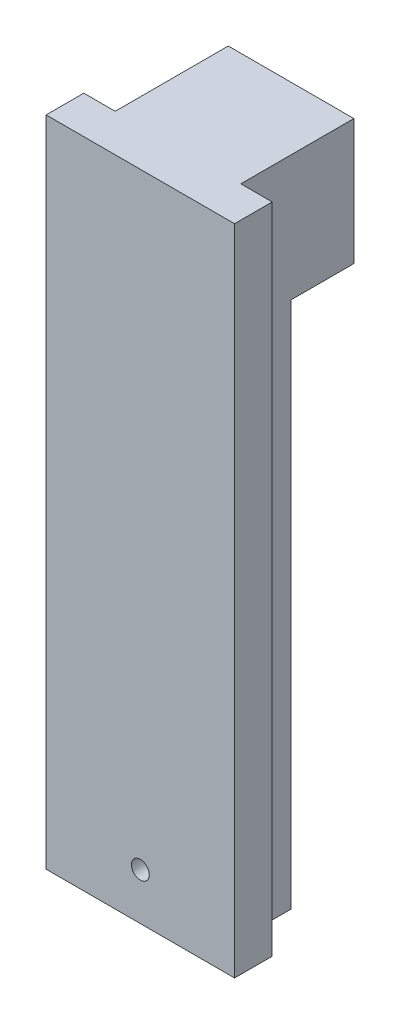
ISO-10303-21;
HEADER;
FILE_DESCRIPTION(('STEP AP214'),'2;1');
FILE_NAME('part.step','',(''),(''),'','','');
FILE_SCHEMA(('AUTOMOTIVE_DESIGN { 1 0 10303 214 1 1 1 1 }'));
ENDSEC;
DATA;
#1=APPLICATION_CONTEXT('core data for automotive mechanical design processes');
#2=APPLICATION_PROTOCOL_DEFINITION('international standard','automotive_design',2000,#1);
#3=PRODUCT_CONTEXT('',#1,'mechanical');
#4=PRODUCT('Part','Part','',(#3));
#5=PRODUCT_RELATED_PRODUCT_CATEGORY('part','',(#4));
#6=PRODUCT_DEFINITION_FORMATION('','',#4);
#7=PRODUCT_DEFINITION_CONTEXT('part definition',#1,'design');
#8=PRODUCT_DEFINITION('design','',#6,#7);
#9=PRODUCT_DEFINITION_SHAPE('','',#8);
#10=(LENGTH_UNIT() NAMED_UNIT(*) SI_UNIT(.MILLI.,.METRE.));
#11=(NAMED_UNIT(*) PLANE_ANGLE_UNIT() SI_UNIT($,.RADIAN.));
#12=(NAMED_UNIT(*) SI_UNIT($,.STERADIAN.) SOLID_ANGLE_UNIT());
#13=UNCERTAINTY_MEASURE_WITH_UNIT(LENGTH_MEASURE(1.E-05),#10,'distance_accuracy_value','');
#14=(GEOMETRIC_REPRESENTATION_CONTEXT(3) GLOBAL_UNCERTAINTY_ASSIGNED_CONTEXT((#13)) GLOBAL_UNIT_ASSIGNED_CONTEXT((#10,
#11,#12)) REPRESENTATION_CONTEXT('',''));
#15=CARTESIAN_POINT('',(0.,0.,0.));
#16=DIRECTION('',(0.,0.,1.));
#17=DIRECTION('',(1.,0.,0.));
#18=AXIS2_PLACEMENT_3D('',#15,#16,#17);
#19=CARTESIAN_POINT('',(10.,104.,-14.));
#20=DIRECTION('',(0.,0.,1.));
#21=DIRECTION('',(1.,0.,0.));
#22=AXIS2_PLACEMENT_3D('',#19,#20,#21);
#23=PLANE('',#22);
#24=CARTESIAN_POINT('',(0.,7.425,-14.));
#25=DIRECTION('',(0.,0.,1.));
#26=DIRECTION('',(1.,0.,0.));
#27=AXIS2_PLACEMENT_3D('',#24,#25,#26);
#28=CIRCLE('',#27,1.425);
#29=CARTESIAN_POINT('',(1.425,7.425,-14.));
#30=VERTEX_POINT('',#29);
#31=EDGE_CURVE('E344',#30,#30,#28,.T.);
#32=ORIENTED_EDGE('',*,*,#31,.T.);
#33=EDGE_LOOP('',(#32));
#34=FACE_BOUND('',#33,.T.);
#35=DIRECTION('',(-1.,0.,0.));
#36=VECTOR('',#35,1.);
#37=CARTESIAN_POINT('',(-10.,84.,-14.));
#38=LINE('',#37,#36);
#39=CARTESIAN_POINT('',(10.,84.,-14.));
#40=VERTEX_POINT('',#39);
#41=CARTESIAN_POINT('',(-10.,84.,-14.));
#42=VERTEX_POINT('',#41);
#43=EDGE_CURVE('E60',#40,#42,#38,.T.);
#44=ORIENTED_EDGE('',*,*,#43,.F.);
#45=DIRECTION('',(0.,-1.,0.));
#46=VECTOR('',#45,1.);
#47=CARTESIAN_POINT('',(10.,104.,-14.));
#48=LINE('',#47,#46);
#49=CARTESIAN_POINT('',(10.,0.,-14.));
#50=VERTEX_POINT('',#49);
#51=EDGE_CURVE('E144',#40,#50,#48,.T.);
#52=ORIENTED_EDGE('',*,*,#51,.T.);
#53=DIRECTION('',(-1.,0.,0.));
#54=VECTOR('',#53,1.);
#55=CARTESIAN_POINT('',(10.,0.,-14.));
#56=LINE('',#55,#54);
#57=CARTESIAN_POINT('',(-10.,0.,-14.));
#58=VERTEX_POINT('',#57);
#59=EDGE_CURVE('E177',#50,#58,#56,.T.);
#60=ORIENTED_EDGE('',*,*,#59,.T.);
#61=DIRECTION('',(0.,-1.,0.));
#62=VECTOR('',#61,1.);
#63=CARTESIAN_POINT('',(-10.,104.,-14.));
#64=LINE('',#63,#62);
#65=EDGE_CURVE('E192',#42,#58,#64,.T.);
#66=ORIENTED_EDGE('',*,*,#65,.F.);
#67=EDGE_LOOP('',(#44,#52,#60,#66));
#68=FACE_BOUND('',#67,.T.);
#69=ADVANCED_FACE('F44',(#34,#68),#23,.F.);
#70=CARTESIAN_POINT('',(-15.,104.,-6.));
#71=DIRECTION('',(1.,0.,0.));
#72=DIRECTION('',(0.,0.,-1.));
#73=AXIS2_PLACEMENT_3D('',#70,#71,#72);
#74=PLANE('',#73);
#75=DIRECTION('',(0.,0.,1.));
#76=VECTOR('',#75,1.);
#77=CARTESIAN_POINT('',(-15.,0.,-6.));
#78=LINE('',#77,#76);
#79=CARTESIAN_POINT('',(-15.,0.,-6.));
#80=VERTEX_POINT('',#79);
#81=CARTESIAN_POINT('',(-15.,0.,0.));
#82=VERTEX_POINT('',#81);
#83=EDGE_CURVE('E161',#80,#82,#78,.T.);
#84=ORIENTED_EDGE('',*,*,#83,.T.);
#85=DIRECTION('',(0.,-1.,0.));
#86=VECTOR('',#85,1.);
#87=CARTESIAN_POINT('',(-15.,104.,0.));
#88=LINE('',#87,#86);
#89=CARTESIAN_POINT('',(-15.,104.,0.));
#90=VERTEX_POINT('',#89);
#91=EDGE_CURVE('E11',#90,#82,#88,.T.);
#92=ORIENTED_EDGE('',*,*,#91,.F.);
#93=DIRECTION('',(0.,0.,1.));
#94=VECTOR('',#93,1.);
#95=CARTESIAN_POINT('',(-15.,104.,-6.));
#96=LINE('',#95,#94);
#97=CARTESIAN_POINT('',(-15.,104.,-6.));
#98=VERTEX_POINT('',#97);
#99=EDGE_CURVE('E186',#98,#90,#96,.T.);
#100=ORIENTED_EDGE('',*,*,#99,.F.);
#101=DIRECTION('',(0.,-1.,0.));
#102=VECTOR('',#101,1.);
#103=CARTESIAN_POINT('',(-15.,104.,-6.));
#104=LINE('',#103,#102);
#105=EDGE_CURVE('E160',#98,#80,#104,.T.);
#106=ORIENTED_EDGE('',*,*,#105,.T.);
#107=EDGE_LOOP('',(#84,#92,#100,#106));
#108=FACE_BOUND('',#107,.T.);
#109=ADVANCED_FACE('F46',(#108),#74,.F.);
#110=CARTESIAN_POINT('',(-15.,104.,0.));
#111=DIRECTION('',(0.,0.,-1.));
#112=DIRECTION('',(-1.,0.,0.));
#113=AXIS2_PLACEMENT_3D('',#110,#111,#112);
#114=PLANE('',#113);
#115=CARTESIAN_POINT('',(0.,7.425,0.));
#116=DIRECTION('',(0.,0.,1.));
#117=DIRECTION('',(1.,0.,0.));
#118=AXIS2_PLACEMENT_3D('',#115,#116,#117);
#119=CIRCLE('',#118,1.425);
#120=CARTESIAN_POINT('',(1.425,7.425,0.));
#121=VERTEX_POINT('',#120);
#122=EDGE_CURVE('E342',#121,#121,#119,.T.);
#123=ORIENTED_EDGE('',*,*,#122,.F.);
#124=EDGE_LOOP('',(#123));
#125=FACE_BOUND('',#124,.T.);
#126=DIRECTION('',(1.,0.,0.));
#127=VECTOR('',#126,1.);
#128=CARTESIAN_POINT('',(-15.,0.,0.));
#129=LINE('',#128,#127);
#130=CARTESIAN_POINT('',(15.,0.,0.));
#131=VERTEX_POINT('',#130);
#132=EDGE_CURVE('E165',#82,#131,#129,.T.);
#133=ORIENTED_EDGE('',*,*,#132,.T.);
#134=DIRECTION('',(0.,-1.,0.));
#135=VECTOR('',#134,1.);
#136=CARTESIAN_POINT('',(15.,104.,0.));
#137=LINE('',#136,#135);
#138=CARTESIAN_POINT('',(15.,104.,0.));
#139=VERTEX_POINT('',#138);
#140=EDGE_CURVE('E53',#139,#131,#137,.T.);
#141=ORIENTED_EDGE('',*,*,#140,.F.);
#142=DIRECTION('',(1.,0.,0.));
#143=VECTOR('',#142,1.);
#144=CARTESIAN_POINT('',(-15.,104.,0.));
#145=LINE('',#144,#143);
#146=EDGE_CURVE('E109',#90,#139,#145,.T.);
#147=ORIENTED_EDGE('',*,*,#146,.F.);
#148=ORIENTED_EDGE('',*,*,#91,.T.);
#149=EDGE_LOOP('',(#133,#141,#147,#148));
#150=FACE_BOUND('',#149,.T.);
#151=ADVANCED_FACE('F232',(#125,#150),#114,.F.);
#152=CARTESIAN_POINT('',(15.,104.,0.));
#153=DIRECTION('',(-1.,0.,0.));
#154=DIRECTION('',(0.,0.,1.));
#155=AXIS2_PLACEMENT_3D('',#152,#153,#154);
#156=PLANE('',#155);
#157=DIRECTION('',(0.,0.,-1.));
#158=VECTOR('',#157,1.);
#159=CARTESIAN_POINT('',(15.,0.,0.));
#160=LINE('',#159,#158);
#161=CARTESIAN_POINT('',(15.,0.,-6.));
#162=VERTEX_POINT('',#161);
#163=EDGE_CURVE('E169',#131,#162,#160,.T.);
#164=ORIENTED_EDGE('',*,*,#163,.T.);
#165=DIRECTION('',(0.,-1.,0.));
#166=VECTOR('',#165,1.);
#167=CARTESIAN_POINT('',(15.,104.,-6.));
#168=LINE('',#167,#166);
#169=CARTESIAN_POINT('',(15.,104.,-6.));
#170=VERTEX_POINT('',#169);
#171=EDGE_CURVE('E143',#170,#162,#168,.T.);
#172=ORIENTED_EDGE('',*,*,#171,.F.);
#173=DIRECTION('',(0.,0.,-1.));
#174=VECTOR('',#173,1.);
#175=CARTESIAN_POINT('',(15.,104.,0.));
#176=LINE('',#175,#174);
#177=EDGE_CURVE('E128',#139,#170,#176,.T.);
#178=ORIENTED_EDGE('',*,*,#177,.F.);
#179=ORIENTED_EDGE('',*,*,#140,.T.);
#180=EDGE_LOOP('',(#164,#172,#178,#179));
#181=FACE_BOUND('',#180,.T.);
#182=ADVANCED_FACE('F202',(#181),#156,.F.);
#183=CARTESIAN_POINT('',(15.,104.,-6.));
#184=DIRECTION('',(0.,0.,1.));
#185=DIRECTION('',(1.,0.,0.));
#186=AXIS2_PLACEMENT_3D('',#183,#184,#185);
#187=PLANE('',#186);
#188=DIRECTION('',(-1.,0.,0.));
#189=VECTOR('',#188,1.);
#190=CARTESIAN_POINT('',(15.,0.,-6.));
#191=LINE('',#190,#189);
#192=CARTESIAN_POINT('',(10.,0.,-6.));
#193=VERTEX_POINT('',#192);
#194=EDGE_CURVE('E138',#162,#193,#191,.T.);
#195=ORIENTED_EDGE('',*,*,#194,.T.);
#196=DIRECTION('',(0.,-1.,0.));
#197=VECTOR('',#196,1.);
#198=CARTESIAN_POINT('',(10.,104.,-6.));
#199=LINE('',#198,#197);
#200=CARTESIAN_POINT('',(10.,104.,-6.));
#201=VERTEX_POINT('',#200);
#202=EDGE_CURVE('E135',#201,#193,#199,.T.);
#203=ORIENTED_EDGE('',*,*,#202,.F.);
#204=DIRECTION('',(-1.,0.,0.));
#205=VECTOR('',#204,1.);
#206=CARTESIAN_POINT('',(15.,104.,-6.));
#207=LINE('',#206,#205);
#208=EDGE_CURVE('E120',#170,#201,#207,.T.);
#209=ORIENTED_EDGE('',*,*,#208,.F.);
#210=ORIENTED_EDGE('',*,*,#171,.T.);
#211=EDGE_LOOP('',(#195,#203,#209,#210));
#212=FACE_BOUND('',#211,.T.);
#213=ADVANCED_FACE('F136',(#212),#187,.F.);
#214=CARTESIAN_POINT('',(10.,104.,-6.));
#215=DIRECTION('',(-1.,0.,0.));
#216=DIRECTION('',(0.,0.,1.));
#217=AXIS2_PLACEMENT_3D('',#214,#215,#216);
#218=PLANE('',#217);
#219=DIRECTION('',(0.,0.,-1.));
#220=VECTOR('',#219,1.);
#221=CARTESIAN_POINT('',(10.,0.,-6.));
#222=LINE('',#221,#220);
#223=EDGE_CURVE('E174',#193,#50,#222,.T.);
#224=ORIENTED_EDGE('',*,*,#223,.T.);
#225=ORIENTED_EDGE('',*,*,#51,.F.);
#226=DIRECTION('',(0.,0.,1.));
#227=VECTOR('',#226,1.);
#228=CARTESIAN_POINT('',(10.,84.,-24.));
#229=LINE('',#228,#227);
#230=CARTESIAN_POINT('',(10.,84.,-24.));
#231=VERTEX_POINT('',#230);
#232=EDGE_CURVE('E166',#231,#40,#229,.T.);
#233=ORIENTED_EDGE('',*,*,#232,.F.);
#234=DIRECTION('',(0.,-1.,0.));
#235=VECTOR('',#234,1.);
#236=CARTESIAN_POINT('',(10.,84.,-24.));
#237=LINE('',#236,#235);
#238=CARTESIAN_POINT('',(9.99999999999999,104.,-24.));
#239=VERTEX_POINT('',#238);
#240=EDGE_CURVE('E150',#239,#231,#237,.T.);
#241=ORIENTED_EDGE('',*,*,#240,.F.);
#242=DIRECTION('',(0.,0.,-1.));
#243=VECTOR('',#242,1.);
#244=CARTESIAN_POINT('',(10.,104.,-6.));
#245=LINE('',#244,#243);
#246=EDGE_CURVE('E125',#201,#239,#245,.T.);
#247=ORIENTED_EDGE('',*,*,#246,.F.);
#248=ORIENTED_EDGE('',*,*,#202,.T.);
#249=EDGE_LOOP('',(#224,#225,#233,#241,#247,#248));
#250=FACE_BOUND('',#249,.T.);
#251=ADVANCED_FACE('F147',(#250),#218,.F.);
#252=CARTESIAN_POINT('',(-10.,104.,-14.));
#253=DIRECTION('',(1.,0.,0.));
#254=DIRECTION('',(0.,0.,-1.));
#255=AXIS2_PLACEMENT_3D('',#252,#253,#254);
#256=PLANE('',#255);
#257=DIRECTION('',(0.,0.,1.));
#258=VECTOR('',#257,1.);
#259=CARTESIAN_POINT('',(-10.,0.,-14.));
#260=LINE('',#259,#258);
#261=CARTESIAN_POINT('',(-10.,0.,-6.));
#262=VERTEX_POINT('',#261);
#263=EDGE_CURVE('E181',#58,#262,#260,.T.);
#264=ORIENTED_EDGE('',*,*,#263,.T.);
#265=DIRECTION('',(0.,-1.,0.));
#266=VECTOR('',#265,1.);
#267=CARTESIAN_POINT('',(-10.,104.,-6.));
#268=LINE('',#267,#266);
#269=CARTESIAN_POINT('',(-10.,104.,-6.));
#270=VERTEX_POINT('',#269);
#271=EDGE_CURVE('E189',#270,#262,#268,.T.);
#272=ORIENTED_EDGE('',*,*,#271,.F.);
#273=DIRECTION('',(0.,0.,1.));
#274=VECTOR('',#273,1.);
#275=CARTESIAN_POINT('',(-10.,104.,-14.));
#276=LINE('',#275,#274);
#277=CARTESIAN_POINT('',(-10.,104.,-24.));
#278=VERTEX_POINT('',#277);
#279=EDGE_CURVE('E152',#278,#270,#276,.T.);
#280=ORIENTED_EDGE('',*,*,#279,.F.);
#281=DIRECTION('',(0.,1.,0.));
#282=VECTOR('',#281,1.);
#283=CARTESIAN_POINT('',(-10.,104.,-24.));
#284=LINE('',#283,#282);
#285=CARTESIAN_POINT('',(-10.,84.,-24.));
#286=VERTEX_POINT('',#285);
#287=EDGE_CURVE('E362',#286,#278,#284,.T.);
#288=ORIENTED_EDGE('',*,*,#287,.F.);
#289=DIRECTION('',(0.,0.,1.));
#290=VECTOR('',#289,1.);
#291=CARTESIAN_POINT('',(-10.,84.,-24.));
#292=LINE('',#291,#290);
#293=EDGE_CURVE('E218',#286,#42,#292,.T.);
#294=ORIENTED_EDGE('',*,*,#293,.T.);
#295=ORIENTED_EDGE('',*,*,#65,.T.);
#296=EDGE_LOOP('',(#264,#272,#280,#288,#294,#295));
#297=FACE_BOUND('',#296,.T.);
#298=ADVANCED_FACE('F251',(#297),#256,.F.);
#299=CARTESIAN_POINT('',(-10.,104.,-6.));
#300=DIRECTION('',(0.,0.,1.));
#301=DIRECTION('',(1.,0.,0.));
#302=AXIS2_PLACEMENT_3D('',#299,#300,#301);
#303=PLANE('',#302);
#304=DIRECTION('',(-1.,0.,0.));
#305=VECTOR('',#304,1.);
#306=CARTESIAN_POINT('',(-10.,0.,-6.));
#307=LINE('',#306,#305);
#308=EDGE_CURVE('E101',#262,#80,#307,.T.);
#309=ORIENTED_EDGE('',*,*,#308,.T.);
#310=ORIENTED_EDGE('',*,*,#105,.F.);
#311=DIRECTION('',(-1.,0.,0.));
#312=VECTOR('',#311,1.);
#313=CARTESIAN_POINT('',(-10.,104.,-6.));
#314=LINE('',#313,#312);
#315=EDGE_CURVE('E69',#270,#98,#314,.T.);
#316=ORIENTED_EDGE('',*,*,#315,.F.);
#317=ORIENTED_EDGE('',*,*,#271,.T.);
#318=EDGE_LOOP('',(#309,#310,#316,#317));
#319=FACE_BOUND('',#318,.T.);
#320=ADVANCED_FACE('F265',(#319),#303,.F.);
#321=CARTESIAN_POINT('',(0.,104.,0.));
#322=DIRECTION('',(0.,1.,0.));
#323=DIRECTION('',(0.,0.,1.));
#324=AXIS2_PLACEMENT_3D('',#321,#322,#323);
#325=PLANE('',#324);
#326=ORIENTED_EDGE('',*,*,#99,.T.);
#327=ORIENTED_EDGE('',*,*,#146,.T.);
#328=ORIENTED_EDGE('',*,*,#177,.T.);
#329=ORIENTED_EDGE('',*,*,#208,.T.);
#330=ORIENTED_EDGE('',*,*,#246,.T.);
#331=DIRECTION('',(1.,0.,0.));
#332=VECTOR('',#331,1.);
#333=CARTESIAN_POINT('',(9.99999999999999,104.,-24.));
#334=LINE('',#333,#332);
#335=EDGE_CURVE('E221',#278,#239,#334,.T.);
#336=ORIENTED_EDGE('',*,*,#335,.F.);
#337=ORIENTED_EDGE('',*,*,#279,.T.);
#338=ORIENTED_EDGE('',*,*,#315,.T.);
#339=EDGE_LOOP('',(#326,#327,#328,#329,#330,#336,#337,#338));
#340=FACE_BOUND('',#339,.T.);
#341=ADVANCED_FACE('F122',(#340),#325,.T.);
#342=CARTESIAN_POINT('',(0.,0.,0.));
#343=DIRECTION('',(0.,1.,0.));
#344=DIRECTION('',(0.,0.,1.));
#345=AXIS2_PLACEMENT_3D('',#342,#343,#344);
#346=PLANE('',#345);
#347=ORIENTED_EDGE('',*,*,#83,.F.);
#348=ORIENTED_EDGE('',*,*,#308,.F.);
#349=ORIENTED_EDGE('',*,*,#263,.F.);
#350=ORIENTED_EDGE('',*,*,#59,.F.);
#351=ORIENTED_EDGE('',*,*,#223,.F.);
#352=ORIENTED_EDGE('',*,*,#194,.F.);
#353=ORIENTED_EDGE('',*,*,#163,.F.);
#354=ORIENTED_EDGE('',*,*,#132,.F.);
#355=EDGE_LOOP('',(#347,#348,#349,#350,#351,#352,#353,#354));
#356=FACE_BOUND('',#355,.T.);
#357=ADVANCED_FACE('F205',(#356),#346,.F.);
#358=CARTESIAN_POINT('',(-10.,84.,-24.));
#359=DIRECTION('',(0.,1.,0.));
#360=DIRECTION('',(0.,0.,1.));
#361=AXIS2_PLACEMENT_3D('',#358,#359,#360);
#362=PLANE('',#361);
#363=ORIENTED_EDGE('',*,*,#43,.T.);
#364=ORIENTED_EDGE('',*,*,#293,.F.);
#365=DIRECTION('',(-1.,0.,0.));
#366=VECTOR('',#365,1.);
#367=CARTESIAN_POINT('',(-10.,84.,-24.));
#368=LINE('',#367,#366);
#369=EDGE_CURVE('E216',#231,#286,#368,.T.);
#370=ORIENTED_EDGE('',*,*,#369,.F.);
#371=ORIENTED_EDGE('',*,*,#232,.T.);
#372=EDGE_LOOP('',(#363,#364,#370,#371));
#373=FACE_BOUND('',#372,.T.);
#374=ADVANCED_FACE('F212',(#373),#362,.F.);
#375=CARTESIAN_POINT('',(0.,0.,-24.));
#376=DIRECTION('',(0.,0.,1.));
#377=DIRECTION('',(1.,0.,0.));
#378=AXIS2_PLACEMENT_3D('',#375,#376,#377);
#379=PLANE('',#378);
#380=CARTESIAN_POINT('',(0.,94.,-24.));
#381=DIRECTION('',(0.,0.,-1.));
#382=DIRECTION('',(-1.,0.,0.));
#383=AXIS2_PLACEMENT_3D('',#380,#381,#382);
#384=CIRCLE('',#383,2.5);
#385=CARTESIAN_POINT('',(-2.50000000000001,94.,-24.));
#386=VERTEX_POINT('',#385);
#387=EDGE_CURVE('E346',#386,#386,#384,.T.);
#388=ORIENTED_EDGE('',*,*,#387,.F.);
#389=EDGE_LOOP('',(#388));
#390=FACE_BOUND('',#389,.T.);
#391=ORIENTED_EDGE('',*,*,#240,.T.);
#392=ORIENTED_EDGE('',*,*,#369,.T.);
#393=ORIENTED_EDGE('',*,*,#287,.T.);
#394=ORIENTED_EDGE('',*,*,#335,.T.);
#395=EDGE_LOOP('',(#391,#392,#393,#394));
#396=FACE_BOUND('',#395,.T.);
#397=ADVANCED_FACE('F301',(#390,#396),#379,.F.);
#398=CARTESIAN_POINT('',(0.,94.,-14.));
#399=DIRECTION('',(0.,0.,-1.));
#400=DIRECTION('',(-1.,0.,0.));
#401=AXIS2_PLACEMENT_3D('',#398,#399,#400);
#402=CYLINDRICAL_SURFACE('',#401,2.5);
#403=CARTESIAN_POINT('',(0.,94.,-14.));
#404=DIRECTION('',(0.,0.,-1.));
#405=DIRECTION('',(-1.,0.,0.));
#406=AXIS2_PLACEMENT_3D('',#403,#404,#405);
#407=CIRCLE('',#406,2.5);
#408=CARTESIAN_POINT('',(-2.50000000000001,94.,-14.));
#409=VERTEX_POINT('',#408);
#410=EDGE_CURVE('E351',#409,#409,#407,.T.);
#411=ORIENTED_EDGE('',*,*,#410,.F.);
#412=EDGE_LOOP('',(#411));
#413=FACE_BOUND('',#412,.T.);
#414=ORIENTED_EDGE('',*,*,#387,.T.);
#415=EDGE_LOOP('',(#414));
#416=FACE_BOUND('',#415,.T.);
#417=ADVANCED_FACE('F309',(#413,#416),#402,.F.);
#418=CARTESIAN_POINT('',(0.,94.,-14.));
#419=DIRECTION('',(0.,0.,-1.));
#420=DIRECTION('',(-1.,0.,0.));
#421=AXIS2_PLACEMENT_3D('',#418,#419,#420);
#422=PLANE('',#421);
#423=ORIENTED_EDGE('',*,*,#410,.T.);
#424=EDGE_LOOP('',(#423));
#425=FACE_BOUND('',#424,.T.);
#426=ADVANCED_FACE('F317',(#425),#422,.T.);
#427=CARTESIAN_POINT('',(0.,7.425,-24.));
#428=DIRECTION('',(0.,0.,1.));
#429=DIRECTION('',(1.,0.,0.));
#430=AXIS2_PLACEMENT_3D('',#427,#428,#429);
#431=CYLINDRICAL_SURFACE('',#430,1.425);
#432=ORIENTED_EDGE('',*,*,#122,.T.);
#433=EDGE_LOOP('',(#432));
#434=FACE_BOUND('',#433,.T.);
#435=ORIENTED_EDGE('',*,*,#31,.F.);
#436=EDGE_LOOP('',(#435));
#437=FACE_BOUND('',#436,.T.);
#438=ADVANCED_FACE('F325',(#434,#437),#431,.F.);
#439=CLOSED_SHELL('',(#69,#109,#151,#182,#213,#251,#298,#320,#341,#357,#374,#397,#417,#426,#438));
#440=MANIFOLD_SOLID_BREP('B2',#439);
#441=ADVANCED_BREP_SHAPE_REPRESENTATION('',(#18,#440),#14);
#442=SHAPE_DEFINITION_REPRESENTATION(#9,#441);
ENDSEC;
END-ISO-10303-21;
